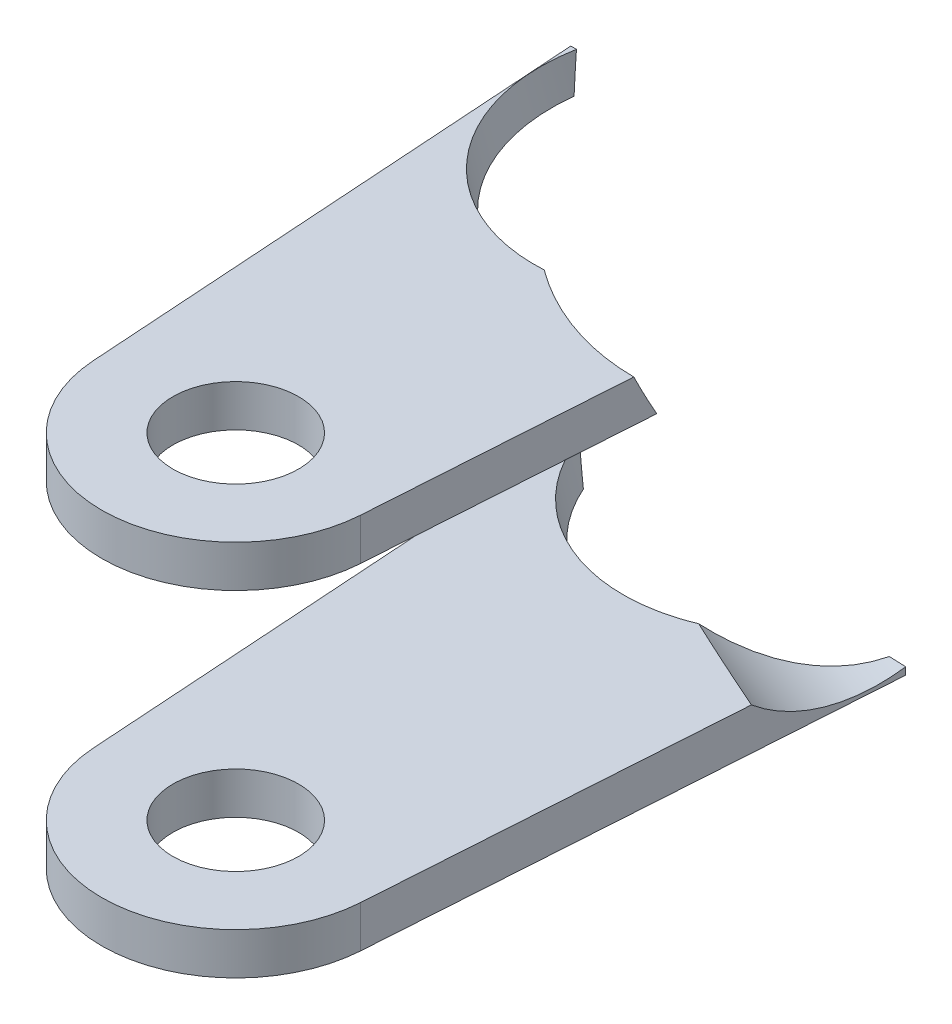
ISO-10303-21;
HEADER;
FILE_DESCRIPTION(('STEP AP214'),'2;1');
FILE_NAME('part.step','',(''),(''),'','','');
FILE_SCHEMA(('AUTOMOTIVE_DESIGN { 1 0 10303 214 1 1 1 1 }'));
ENDSEC;
DATA;
#1=APPLICATION_CONTEXT('core data for automotive mechanical design processes');
#2=APPLICATION_PROTOCOL_DEFINITION('international standard','automotive_design',2000,#1);
#3=PRODUCT_CONTEXT('',#1,'mechanical');
#4=PRODUCT('Part','Part','',(#3));
#5=PRODUCT_RELATED_PRODUCT_CATEGORY('part','',(#4));
#6=PRODUCT_DEFINITION_FORMATION('','',#4);
#7=PRODUCT_DEFINITION_CONTEXT('part definition',#1,'design');
#8=PRODUCT_DEFINITION('design','',#6,#7);
#9=PRODUCT_DEFINITION_SHAPE('','',#8);
#10=(LENGTH_UNIT() NAMED_UNIT(*) SI_UNIT(.MILLI.,.METRE.));
#11=(NAMED_UNIT(*) PLANE_ANGLE_UNIT() SI_UNIT($,.RADIAN.));
#12=(NAMED_UNIT(*) SI_UNIT($,.STERADIAN.) SOLID_ANGLE_UNIT());
#13=UNCERTAINTY_MEASURE_WITH_UNIT(LENGTH_MEASURE(1.E-05),#10,'distance_accuracy_value','');
#14=(GEOMETRIC_REPRESENTATION_CONTEXT(3) GLOBAL_UNCERTAINTY_ASSIGNED_CONTEXT((#13)) GLOBAL_UNIT_ASSIGNED_CONTEXT((#10,
#11,#12)) REPRESENTATION_CONTEXT('',''));
#15=CARTESIAN_POINT('',(0.,0.,0.));
#16=DIRECTION('',(0.,0.,1.));
#17=DIRECTION('',(1.,0.,0.));
#18=AXIS2_PLACEMENT_3D('',#15,#16,#17);
#19=CARTESIAN_POINT('',(3.17109766763384,220.113863817674,22.0614422229637));
#20=DIRECTION('',(-0.013871818318609,-0.962877794478014,-0.269581018541161));
#21=DIRECTION('',(-0.999896240744035,0.0144051291540904,0.));
#22=AXIS2_PLACEMENT_3D('',#19,#20,#21);
#23=CYLINDRICAL_SURFACE('',#22,12.7);
#24=CARTESIAN_POINT('',(-0.16036805510547,-11.13155,-42.6813263271571));
#25=DIRECTION('',(0.,1.,0.));
#26=DIRECTION('',(-0.0513889655776079,0.,-0.998678714210363));
#27=AXIS2_PLACEMENT_3D('',#24,#25,#26);
#28=ELLIPSE('',#27,13.1896280845118,12.7);
#29=CARTESIAN_POINT('',(4.64570925519736,-11.13155,-30.4542928114946));
#30=VERTEX_POINT('',#29);
#31=CARTESIAN_POINT('',(-12.0534953152457,-11.13155,-38.1));
#32=VERTEX_POINT('',#31);
#33=EDGE_CURVE('E218',#30,#32,#28,.F.);
#34=ORIENTED_EDGE('',*,*,#33,.F.);
#35=CARTESIAN_POINT('',(-1.50270421106491E-13,2.47198095326695E-13,-39.5647786155457));
#36=DIRECTION('',(-0.681508036132345,-0.612366440673234,-0.400692075070407));
#37=DIRECTION('',(0.661890322531393,-0.749348395185467,0.0194469424911433));
#38=AXIS2_PLACEMENT_3D('',#35,#36,#37);
#39=ELLIPSE('',#38,17.9605122421383,12.7);
#40=CARTESIAN_POINT('',(11.4522485980504,-13.7037631015714,-38.1));
#41=VERTEX_POINT('',#40);
#42=EDGE_CURVE('E203',#30,#41,#39,.F.);
#43=ORIENTED_EDGE('',*,*,#42,.T.);
#44=CARTESIAN_POINT('',(0.0753730471890922,5.23183275427799,-38.1));
#45=DIRECTION('',(0.,0.,1.));
#46=DIRECTION('',(-0.0144051291540903,-0.999896240744035,0.));
#47=AXIS2_PLACEMENT_3D('',#44,#45,#46);
#48=ELLIPSE('',#47,47.1101417626734,12.7);
#49=CARTESIAN_POINT('',(11.3714792605542,-14.30655,-38.1));
#50=VERTEX_POINT('',#49);
#51=EDGE_CURVE('E211',#41,#50,#48,.F.);
#52=ORIENTED_EDGE('',*,*,#51,.T.);
#53=CARTESIAN_POINT('',(-0.206109086225063,-14.30655,-43.5702446704576));
#54=DIRECTION('',(0.,1.,0.));
#55=DIRECTION('',(-0.0513889655776079,0.,-0.998678714210363));
#56=AXIS2_PLACEMENT_3D('',#53,#54,#55);
#57=ELLIPSE('',#56,13.1896280845118,12.7);
#58=CARTESIAN_POINT('',(-11.7427767355241,-14.30655,-38.1));
#59=VERTEX_POINT('',#58);
#60=EDGE_CURVE('E252',#50,#59,#57,.F.);
#61=ORIENTED_EDGE('',*,*,#60,.T.);
#62=EDGE_CURVE('E226',#59,#32,#48,.F.);
#63=ORIENTED_EDGE('',*,*,#62,.T.);
#64=EDGE_LOOP('',(#34,#43,#52,#61,#63));
#65=FACE_BOUND('',#64,.T.);
#66=ADVANCED_FACE('F148',(#65),#23,.F.);
#67=CARTESIAN_POINT('',(0.,-14.30655,-38.1));
#68=DIRECTION('',(0.,0.,1.));
#69=DIRECTION('',(1.,0.,0.));
#70=AXIS2_PLACEMENT_3D('',#67,#68,#69);
#71=PLANE('',#70);
#72=ORIENTED_EDGE('',*,*,#62,.F.);
#73=DIRECTION('',(1.,0.,0.));
#74=VECTOR('',#73,1.);
#75=CARTESIAN_POINT('',(0.,-14.30655,-38.1));
#76=LINE('',#75,#74);
#77=CARTESIAN_POINT('',(-12.7,-14.30655,-38.1));
#78=VERTEX_POINT('',#77);
#79=EDGE_CURVE('E262',#78,#59,#76,.T.);
#80=ORIENTED_EDGE('',*,*,#79,.F.);
#81=DIRECTION('',(0.,1.,0.));
#82=VECTOR('',#81,1.);
#83=CARTESIAN_POINT('',(-12.7,-14.30655,-38.1));
#84=LINE('',#83,#82);
#85=CARTESIAN_POINT('',(-12.7,-11.13155,-38.1));
#86=VERTEX_POINT('',#85);
#87=EDGE_CURVE('E244',#78,#86,#84,.T.);
#88=ORIENTED_EDGE('',*,*,#87,.T.);
#89=DIRECTION('',(1.,0.,0.));
#90=VECTOR('',#89,1.);
#91=CARTESIAN_POINT('',(0.,-11.13155,-38.1));
#92=LINE('',#91,#90);
#93=EDGE_CURVE('E152',#86,#32,#92,.T.);
#94=ORIENTED_EDGE('',*,*,#93,.T.);
#95=EDGE_LOOP('',(#72,#80,#88,#94));
#96=FACE_BOUND('',#95,.T.);
#97=ADVANCED_FACE('F306',(#96),#71,.F.);
#98=CARTESIAN_POINT('',(4.68364304593903,-0.477575824424958,-38.1));
#99=DIRECTION('',(0.,0.,1.));
#100=DIRECTION('',(-0.994841581932163,0.101440755412758,0.));
#101=AXIS2_PLACEMENT_3D('',#98,#99,#100);
#102=ELLIPSE('',#101,42.7489747236035,12.7);
#103=CARTESIAN_POINT('',(12.7,-13.7536305525017,-38.1));
#104=VERTEX_POINT('',#103);
#105=EDGE_CURVE('E13',#104,#41,#102,.F.);
#106=ORIENTED_EDGE('',*,*,#105,.F.);
#107=DIRECTION('',(0.,1.,0.));
#108=VECTOR('',#107,1.);
#109=CARTESIAN_POINT('',(12.7,-14.30655,-38.1));
#110=LINE('',#109,#108);
#111=CARTESIAN_POINT('',(12.7,-14.30655,-38.1));
#112=VERTEX_POINT('',#111);
#113=EDGE_CURVE('E234',#112,#104,#110,.T.);
#114=ORIENTED_EDGE('',*,*,#113,.F.);
#115=EDGE_CURVE('E266',#50,#112,#76,.T.);
#116=ORIENTED_EDGE('',*,*,#115,.F.);
#117=ORIENTED_EDGE('',*,*,#51,.F.);
#118=EDGE_LOOP('',(#106,#114,#116,#117));
#119=FACE_BOUND('',#118,.T.);
#120=ADVANCED_FACE('F150',(#119),#71,.F.);
#121=CARTESIAN_POINT('',(10.1378868864585,-14.30655,0.669962295486161));
#122=DIRECTION('',(0.997823512446701,0.,0.065941170815567));
#123=DIRECTION('',(0.065941170815567,0.,-0.997823512446701));
#124=AXIS2_PLACEMENT_3D('',#121,#122,#123);
#125=PLANE('',#124);
#126=ORIENTED_EDGE('',*,*,#113,.T.);
#127=CARTESIAN_POINT('',(12.5376755950058,-1.27842593893902,-35.643702880251));
#128=DIRECTION('',(0.997823512446701,0.,0.065941170815567));
#129=DIRECTION('',(0.0609199612436631,0.382747014080803,-0.921842438562198));
#130=AXIS2_PLACEMENT_3D('',#127,#128,#129);
#131=ELLIPSE('',#130,13.1273124297438,12.7);
#132=CARTESIAN_POINT('',(11.9746101856044,-11.13155,-27.1233824552835));
#133=VERTEX_POINT('',#132);
#134=EDGE_CURVE('E167',#104,#133,#131,.F.);
#135=ORIENTED_EDGE('',*,*,#134,.T.);
#136=DIRECTION('',(0.065941170815567,0.,-0.997823512446701));
#137=VECTOR('',#136,1.);
#138=CARTESIAN_POINT('',(10.1378868864585,-11.13155,0.669962295486161));
#139=LINE('',#138,#137);
#140=CARTESIAN_POINT('',(10.1378868864585,-11.13155,0.669962295486162));
#141=VERTEX_POINT('',#140);
#142=EDGE_CURVE('E222',#141,#133,#139,.T.);
#143=ORIENTED_EDGE('',*,*,#142,.F.);
#144=DIRECTION('',(0.,1.,0.));
#145=VECTOR('',#144,1.);
#146=CARTESIAN_POINT('',(10.1378868864585,-14.30655,0.669962295486162));
#147=LINE('',#146,#145);
#148=CARTESIAN_POINT('',(10.1378868864585,-14.30655,0.669962295486162));
#149=VERTEX_POINT('',#148);
#150=EDGE_CURVE('E271',#149,#141,#147,.T.);
#151=ORIENTED_EDGE('',*,*,#150,.F.);
#152=DIRECTION('',(0.065941170815567,0.,-0.997823512446701));
#153=VECTOR('',#152,1.);
#154=CARTESIAN_POINT('',(10.1378868864585,-14.30655,0.669962295486161));
#155=LINE('',#154,#153);
#156=EDGE_CURVE('E242',#149,#112,#155,.T.);
#157=ORIENTED_EDGE('',*,*,#156,.T.);
#158=EDGE_LOOP('',(#126,#135,#143,#151,#157));
#159=FACE_BOUND('',#158,.T.);
#160=ADVANCED_FACE('F291',(#159),#125,.T.);
#161=CARTESIAN_POINT('',(0.,-14.30655,0.));
#162=DIRECTION('',(0.,1.,0.));
#163=DIRECTION('',(0.,0.,1.));
#164=AXIS2_PLACEMENT_3D('',#161,#162,#163);
#165=CYLINDRICAL_SURFACE('',#164,10.16);
#166=CARTESIAN_POINT('',(0.,-11.13155,0.));
#167=DIRECTION('',(0.,1.,0.));
#168=DIRECTION('',(0.,0.,1.));
#169=AXIS2_PLACEMENT_3D('',#166,#167,#168);
#170=CIRCLE('',#169,10.16);
#171=CARTESIAN_POINT('',(-10.1378868864585,-11.13155,0.669962295486162));
#172=VERTEX_POINT('',#171);
#173=EDGE_CURVE('E159',#172,#141,#170,.T.);
#174=ORIENTED_EDGE('',*,*,#173,.F.);
#175=DIRECTION('',(0.,1.,0.));
#176=VECTOR('',#175,1.);
#177=CARTESIAN_POINT('',(-10.1378868864585,-14.30655,0.669962295486162));
#178=LINE('',#177,#176);
#179=CARTESIAN_POINT('',(-10.1378868864585,-14.30655,0.669962295486162));
#180=VERTEX_POINT('',#179);
#181=EDGE_CURVE('E254',#180,#172,#178,.T.);
#182=ORIENTED_EDGE('',*,*,#181,.F.);
#183=CARTESIAN_POINT('',(0.,-14.30655,0.));
#184=DIRECTION('',(0.,1.,0.));
#185=DIRECTION('',(0.,0.,1.));
#186=AXIS2_PLACEMENT_3D('',#183,#184,#185);
#187=CIRCLE('',#186,10.16);
#188=EDGE_CURVE('E267',#180,#149,#187,.T.);
#189=ORIENTED_EDGE('',*,*,#188,.T.);
#190=ORIENTED_EDGE('',*,*,#150,.T.);
#191=EDGE_LOOP('',(#174,#182,#189,#190));
#192=FACE_BOUND('',#191,.T.);
#193=ADVANCED_FACE('F287',(#192),#165,.T.);
#194=CARTESIAN_POINT('',(-10.1378868864585,-14.30655,0.669962295486161));
#195=DIRECTION('',(0.997823512446701,0.,-0.065941170815567));
#196=DIRECTION('',(-0.065941170815567,0.,-0.997823512446701));
#197=AXIS2_PLACEMENT_3D('',#194,#195,#196);
#198=PLANE('',#197);
#199=DIRECTION('',(-0.065941170815567,0.,-0.997823512446701));
#200=VECTOR('',#199,1.);
#201=CARTESIAN_POINT('',(-10.1378868864585,-11.13155,0.669962295486161));
#202=LINE('',#201,#200);
#203=EDGE_CURVE('E278',#172,#86,#202,.T.);
#204=ORIENTED_EDGE('',*,*,#203,.T.);
#205=ORIENTED_EDGE('',*,*,#87,.F.);
#206=DIRECTION('',(-0.065941170815567,0.,-0.997823512446701));
#207=VECTOR('',#206,1.);
#208=CARTESIAN_POINT('',(-10.1378868864585,-14.30655,0.669962295486161));
#209=LINE('',#208,#207);
#210=EDGE_CURVE('E263',#180,#78,#209,.T.);
#211=ORIENTED_EDGE('',*,*,#210,.F.);
#212=ORIENTED_EDGE('',*,*,#181,.T.);
#213=EDGE_LOOP('',(#204,#205,#211,#212));
#214=FACE_BOUND('',#213,.T.);
#215=ADVANCED_FACE('F299',(#214),#198,.F.);
#216=CARTESIAN_POINT('',(0.,-14.30655,0.));
#217=DIRECTION('',(0.,1.,0.));
#218=DIRECTION('',(0.,0.,1.));
#219=AXIS2_PLACEMENT_3D('',#216,#217,#218);
#220=CYLINDRICAL_SURFACE('',#219,4.7625);
#221=CARTESIAN_POINT('',(0.,-14.30655,0.));
#222=DIRECTION('',(0.,1.,0.));
#223=DIRECTION('',(0.,0.,1.));
#224=AXIS2_PLACEMENT_3D('',#221,#222,#223);
#225=CIRCLE('',#224,4.7625);
#226=CARTESIAN_POINT('',(0.,-14.30655,4.7625));
#227=VERTEX_POINT('',#226);
#228=EDGE_CURVE('E274',#227,#227,#225,.T.);
#229=ORIENTED_EDGE('',*,*,#228,.F.);
#230=EDGE_LOOP('',(#229));
#231=FACE_BOUND('',#230,.T.);
#232=CARTESIAN_POINT('',(0.,-11.13155,0.));
#233=DIRECTION('',(0.,1.,0.));
#234=DIRECTION('',(0.,0.,1.));
#235=AXIS2_PLACEMENT_3D('',#232,#233,#234);
#236=CIRCLE('',#235,4.7625);
#237=CARTESIAN_POINT('',(0.,-11.13155,4.7625));
#238=VERTEX_POINT('',#237);
#239=EDGE_CURVE('E281',#238,#238,#236,.T.);
#240=ORIENTED_EDGE('',*,*,#239,.T.);
#241=EDGE_LOOP('',(#240));
#242=FACE_BOUND('',#241,.T.);
#243=ADVANCED_FACE('F323',(#231,#242),#220,.F.);
#244=CARTESIAN_POINT('',(0.,-14.30655,0.));
#245=DIRECTION('',(0.,1.,0.));
#246=DIRECTION('',(0.,0.,1.));
#247=AXIS2_PLACEMENT_3D('',#244,#245,#246);
#248=PLANE('',#247);
#249=ORIENTED_EDGE('',*,*,#60,.F.);
#250=ORIENTED_EDGE('',*,*,#115,.T.);
#251=ORIENTED_EDGE('',*,*,#156,.F.);
#252=ORIENTED_EDGE('',*,*,#188,.F.);
#253=ORIENTED_EDGE('',*,*,#210,.T.);
#254=ORIENTED_EDGE('',*,*,#79,.T.);
#255=EDGE_LOOP('',(#249,#250,#251,#252,#253,#254));
#256=FACE_BOUND('',#255,.T.);
#257=ORIENTED_EDGE('',*,*,#228,.T.);
#258=EDGE_LOOP('',(#257));
#259=FACE_BOUND('',#258,.T.);
#260=ADVANCED_FACE('F301',(#256,#259),#248,.F.);
#261=CARTESIAN_POINT('',(0.,-11.13155,0.));
#262=DIRECTION('',(0.,1.,0.));
#263=DIRECTION('',(0.,0.,1.));
#264=AXIS2_PLACEMENT_3D('',#261,#262,#263);
#265=PLANE('',#264);
#266=ORIENTED_EDGE('',*,*,#142,.T.);
#267=CARTESIAN_POINT('',(109.168437935,-11.13155,-5.42306631781568));
#268=DIRECTION('',(0.,1.,0.));
#269=DIRECTION('',(-0.954413808532874,0.,-0.298486653104918));
#270=AXIS2_PLACEMENT_3D('',#267,#268,#269);
#271=ELLIPSE('',#270,131.115899945305,12.7);
#272=EDGE_CURVE('E206',#133,#30,#271,.F.);
#273=ORIENTED_EDGE('',*,*,#272,.T.);
#274=ORIENTED_EDGE('',*,*,#33,.T.);
#275=ORIENTED_EDGE('',*,*,#93,.F.);
#276=ORIENTED_EDGE('',*,*,#203,.F.);
#277=ORIENTED_EDGE('',*,*,#173,.T.);
#278=EDGE_LOOP('',(#266,#273,#274,#275,#276,#277));
#279=FACE_BOUND('',#278,.T.);
#280=ORIENTED_EDGE('',*,*,#239,.F.);
#281=EDGE_LOOP('',(#280));
#282=FACE_BOUND('',#281,.T.);
#283=ADVANCED_FACE('F215',(#279,#282),#265,.T.);
#284=CARTESIAN_POINT('',(117.314855269663,-11.9622136386577,-2.87532777581251));
#285=DIRECTION('',(-0.949926089246007,0.096860868935787,-0.297083148358826));
#286=DIRECTION('',(0.312166618372823,0.251960959218206,-0.91600637410638));
#287=AXIS2_PLACEMENT_3D('',#284,#285,#286);
#288=CYLINDRICAL_SURFACE('',#287,12.7);
#289=ORIENTED_EDGE('',*,*,#105,.T.);
#290=ORIENTED_EDGE('',*,*,#42,.F.);
#291=ORIENTED_EDGE('',*,*,#272,.F.);
#292=ORIENTED_EDGE('',*,*,#134,.F.);
#293=EDGE_LOOP('',(#289,#290,#291,#292));
#294=FACE_BOUND('',#293,.T.);
#295=ADVANCED_FACE('F205',(#294),#288,.F.);
#296=CLOSED_SHELL('',(#66,#97,#120,#160,#193,#215,#243,#260,#283,#295));
#297=MANIFOLD_SOLID_BREP('B2',#296);
#298=CARTESIAN_POINT('',(-10.1378868864585,14.30655,0.669962295486161));
#299=DIRECTION('',(-0.997823512446701,0.,0.065941170815567));
#300=DIRECTION('',(0.065941170815567,0.,0.997823512446701));
#301=AXIS2_PLACEMENT_3D('',#298,#299,#300);
#302=PLANE('',#301);
#303=DIRECTION('',(-0.065941170815567,0.,-0.997823512446701));
#304=VECTOR('',#303,1.);
#305=CARTESIAN_POINT('',(-10.1378868864585,11.13155,0.669962295486161));
#306=LINE('',#305,#304);
#307=CARTESIAN_POINT('',(-10.1378868864585,11.13155,0.669962295486162));
#308=VERTEX_POINT('',#307);
#309=CARTESIAN_POINT('',(-12.7,11.13155,-38.1));
#310=VERTEX_POINT('',#309);
#311=EDGE_CURVE('E493',#308,#310,#306,.T.);
#312=ORIENTED_EDGE('',*,*,#311,.F.);
#313=DIRECTION('',(0.,-1.,0.));
#314=VECTOR('',#313,1.);
#315=CARTESIAN_POINT('',(-10.1378868864585,14.30655,0.669962295486162));
#316=LINE('',#315,#314);
#317=CARTESIAN_POINT('',(-10.1378868864585,14.30655,0.669962295486162));
#318=VERTEX_POINT('',#317);
#319=EDGE_CURVE('E496',#318,#308,#316,.T.);
#320=ORIENTED_EDGE('',*,*,#319,.F.);
#321=DIRECTION('',(-0.065941170815567,0.,-0.997823512446701));
#322=VECTOR('',#321,1.);
#323=CARTESIAN_POINT('',(-10.1378868864585,14.30655,0.669962295486161));
#324=LINE('',#323,#322);
#325=CARTESIAN_POINT('',(-12.7,14.30655,-38.1));
#326=VERTEX_POINT('',#325);
#327=EDGE_CURVE('E500',#318,#326,#324,.T.);
#328=ORIENTED_EDGE('',*,*,#327,.T.);
#329=DIRECTION('',(0.,-1.,0.));
#330=VECTOR('',#329,1.);
#331=CARTESIAN_POINT('',(-12.7,14.30655,-38.1));
#332=LINE('',#331,#330);
#333=EDGE_CURVE('E497',#326,#310,#332,.T.);
#334=ORIENTED_EDGE('',*,*,#333,.T.);
#335=EDGE_LOOP('',(#312,#320,#328,#334));
#336=FACE_BOUND('',#335,.T.);
#337=ADVANCED_FACE('F402',(#336),#302,.T.);
#338=CARTESIAN_POINT('',(0.,14.30655,0.));
#339=DIRECTION('',(0.,-1.,0.));
#340=DIRECTION('',(0.,0.,-1.));
#341=AXIS2_PLACEMENT_3D('',#338,#339,#340);
#342=CYLINDRICAL_SURFACE('',#341,10.16);
#343=CARTESIAN_POINT('',(0.,11.13155,0.));
#344=DIRECTION('',(0.,1.,0.));
#345=DIRECTION('',(0.,0.,1.));
#346=AXIS2_PLACEMENT_3D('',#343,#344,#345);
#347=CIRCLE('',#346,10.16);
#348=CARTESIAN_POINT('',(10.1378868864585,11.13155,0.669962295486162));
#349=VERTEX_POINT('',#348);
#350=EDGE_CURVE('E495',#308,#349,#347,.T.);
#351=ORIENTED_EDGE('',*,*,#350,.T.);
#352=DIRECTION('',(0.,-1.,0.));
#353=VECTOR('',#352,1.);
#354=CARTESIAN_POINT('',(10.1378868864585,14.30655,0.669962295486162));
#355=LINE('',#354,#353);
#356=CARTESIAN_POINT('',(10.1378868864585,14.30655,0.669962295486162));
#357=VERTEX_POINT('',#356);
#358=EDGE_CURVE('E501',#357,#349,#355,.T.);
#359=ORIENTED_EDGE('',*,*,#358,.F.);
#360=CARTESIAN_POINT('',(0.,14.30655,0.));
#361=DIRECTION('',(0.,1.,0.));
#362=DIRECTION('',(0.,0.,1.));
#363=AXIS2_PLACEMENT_3D('',#360,#361,#362);
#364=CIRCLE('',#363,10.16);
#365=EDGE_CURVE('E476',#318,#357,#364,.T.);
#366=ORIENTED_EDGE('',*,*,#365,.F.);
#367=ORIENTED_EDGE('',*,*,#319,.T.);
#368=EDGE_LOOP('',(#351,#359,#366,#367));
#369=FACE_BOUND('',#368,.T.);
#370=ADVANCED_FACE('F507',(#369),#342,.T.);
#371=CARTESIAN_POINT('',(10.1378868864585,14.30655,0.669962295486161));
#372=DIRECTION('',(-0.997823512446701,0.,-0.065941170815567));
#373=DIRECTION('',(-0.065941170815567,0.,0.997823512446701));
#374=AXIS2_PLACEMENT_3D('',#371,#372,#373);
#375=PLANE('',#374);
#376=CARTESIAN_POINT('',(12.1420416601469,20.976603051953,-29.6569598843132));
#377=DIRECTION('',(-0.997823512446701,0.,-0.065941170815567));
#378=DIRECTION('',(-0.0262083361860295,0.91762371502674,0.396585225058731));
#379=AXIS2_PLACEMENT_3D('',#376,#377,#378);
#380=ELLIPSE('',#379,26.042806816391,12.7);
#381=CARTESIAN_POINT('',(11.4220500743455,14.30655,-18.7620284751373));
#382=VERTEX_POINT('',#381);
#383=CARTESIAN_POINT('',(11.5300248368222,11.13155,-20.3959053902345));
#384=VERTEX_POINT('',#383);
#385=EDGE_CURVE('E449',#382,#384,#380,.F.);
#386=ORIENTED_EDGE('',*,*,#385,.F.);
#387=DIRECTION('',(0.065941170815567,0.,-0.997823512446701));
#388=VECTOR('',#387,1.);
#389=CARTESIAN_POINT('',(10.1378868864585,14.30655,0.669962295486161));
#390=LINE('',#389,#388);
#391=EDGE_CURVE('E477',#357,#382,#390,.T.);
#392=ORIENTED_EDGE('',*,*,#391,.F.);
#393=ORIENTED_EDGE('',*,*,#358,.T.);
#394=DIRECTION('',(0.065941170815567,0.,-0.997823512446701));
#395=VECTOR('',#394,1.);
#396=CARTESIAN_POINT('',(10.1378868864585,11.13155,0.669962295486161));
#397=LINE('',#396,#395);
#398=EDGE_CURVE('E406',#349,#384,#397,.T.);
#399=ORIENTED_EDGE('',*,*,#398,.T.);
#400=EDGE_LOOP('',(#386,#392,#393,#399));
#401=FACE_BOUND('',#400,.T.);
#402=ADVANCED_FACE('F520',(#401),#375,.F.);
#403=CARTESIAN_POINT('',(0.,14.30655,-38.1));
#404=DIRECTION('',(0.,0.,-1.));
#405=DIRECTION('',(-1.,0.,0.));
#406=AXIS2_PLACEMENT_3D('',#403,#404,#405);
#407=PLANE('',#406);
#408=DIRECTION('',(1.,0.,0.));
#409=VECTOR('',#408,1.);
#410=CARTESIAN_POINT('',(0.,14.30655,-38.1));
#411=LINE('',#410,#409);
#412=CARTESIAN_POINT('',(-12.2667001888941,14.30655,-38.1));
#413=VERTEX_POINT('',#412);
#414=EDGE_CURVE('E488',#326,#413,#411,.T.);
#415=ORIENTED_EDGE('',*,*,#414,.T.);
#416=CARTESIAN_POINT('',(0.0753730471890922,5.23183275427799,-38.1));
#417=DIRECTION('',(0.,0.,-1.));
#418=DIRECTION('',(-0.0144051291540903,-0.999896240744035,0.));
#419=AXIS2_PLACEMENT_3D('',#416,#417,#418);
#420=ELLIPSE('',#419,47.1101417626734,12.7);
#421=CARTESIAN_POINT('',(-12.4470215803562,11.13155,-38.1));
#422=VERTEX_POINT('',#421);
#423=EDGE_CURVE('E484',#413,#422,#420,.F.);
#424=ORIENTED_EDGE('',*,*,#423,.T.);
#425=DIRECTION('',(1.,0.,0.));
#426=VECTOR('',#425,1.);
#427=CARTESIAN_POINT('',(0.,11.13155,-38.1));
#428=LINE('',#427,#426);
#429=EDGE_CURVE('E469',#310,#422,#428,.T.);
#430=ORIENTED_EDGE('',*,*,#429,.F.);
#431=ORIENTED_EDGE('',*,*,#333,.F.);
#432=EDGE_LOOP('',(#415,#424,#430,#431));
#433=FACE_BOUND('',#432,.T.);
#434=ADVANCED_FACE('F516',(#433),#407,.T.);
#435=CARTESIAN_POINT('',(0.,14.30655,0.));
#436=DIRECTION('',(0.,-1.,0.));
#437=DIRECTION('',(0.,0.,-1.));
#438=AXIS2_PLACEMENT_3D('',#435,#436,#437);
#439=CYLINDRICAL_SURFACE('',#438,4.7625);
#440=CARTESIAN_POINT('',(0.,14.30655,0.));
#441=DIRECTION('',(0.,1.,0.));
#442=DIRECTION('',(0.,0.,1.));
#443=AXIS2_PLACEMENT_3D('',#440,#441,#442);
#444=CIRCLE('',#443,4.7625);
#445=CARTESIAN_POINT('',(0.,14.30655,4.7625));
#446=VERTEX_POINT('',#445);
#447=EDGE_CURVE('E479',#446,#446,#444,.T.);
#448=ORIENTED_EDGE('',*,*,#447,.T.);
#449=EDGE_LOOP('',(#448));
#450=FACE_BOUND('',#449,.T.);
#451=CARTESIAN_POINT('',(0.,11.13155,0.));
#452=DIRECTION('',(0.,1.,0.));
#453=DIRECTION('',(0.,0.,1.));
#454=AXIS2_PLACEMENT_3D('',#451,#452,#453);
#455=CIRCLE('',#454,4.7625);
#456=CARTESIAN_POINT('',(0.,11.13155,4.7625));
#457=VERTEX_POINT('',#456);
#458=EDGE_CURVE('E470',#457,#457,#455,.T.);
#459=ORIENTED_EDGE('',*,*,#458,.F.);
#460=EDGE_LOOP('',(#459));
#461=FACE_BOUND('',#460,.T.);
#462=ADVANCED_FACE('F526',(#450,#461),#439,.F.);
#463=CARTESIAN_POINT('',(0.,14.30655,0.));
#464=DIRECTION('',(0.,1.,0.));
#465=DIRECTION('',(0.,0.,1.));
#466=AXIS2_PLACEMENT_3D('',#463,#464,#465);
#467=PLANE('',#466);
#468=ORIENTED_EDGE('',*,*,#391,.T.);
#469=CARTESIAN_POINT('',(8.28116571986139,14.30655,-32.8074069039178));
#470=DIRECTION('',(0.,1.,0.));
#471=DIRECTION('',(0.774787847465351,0.,0.632221315221188));
#472=AXIS2_PLACEMENT_3D('',#469,#470,#471);
#473=ELLIPSE('',#472,15.8528642903054,12.7);
#474=CARTESIAN_POINT('',(0.991045245278553,14.30655,-22.3930959683463));
#475=VERTEX_POINT('',#474);
#476=EDGE_CURVE('E420',#382,#475,#473,.F.);
#477=ORIENTED_EDGE('',*,*,#476,.T.);
#478=CARTESIAN_POINT('',(0.206109086224706,14.30655,-35.5593125606339));
#479=DIRECTION('',(0.,1.,0.));
#480=DIRECTION('',(-0.0513889655776079,0.,-0.998678714210363));
#481=AXIS2_PLACEMENT_3D('',#478,#479,#480);
#482=ELLIPSE('',#481,13.1896280845118,12.7);
#483=EDGE_CURVE('E463',#475,#413,#482,.F.);
#484=ORIENTED_EDGE('',*,*,#483,.T.);
#485=ORIENTED_EDGE('',*,*,#414,.F.);
#486=ORIENTED_EDGE('',*,*,#327,.F.);
#487=ORIENTED_EDGE('',*,*,#365,.T.);
#488=EDGE_LOOP('',(#468,#477,#484,#485,#486,#487));
#489=FACE_BOUND('',#488,.T.);
#490=ORIENTED_EDGE('',*,*,#447,.F.);
#491=EDGE_LOOP('',(#490));
#492=FACE_BOUND('',#491,.T.);
#493=ADVANCED_FACE('F539',(#489,#492),#467,.T.);
#494=CARTESIAN_POINT('',(0.,11.13155,0.));
#495=DIRECTION('',(0.,1.,0.));
#496=DIRECTION('',(0.,0.,1.));
#497=AXIS2_PLACEMENT_3D('',#494,#495,#496);
#498=PLANE('',#497);
#499=CARTESIAN_POINT('',(6.44335708251972,11.13155,-34.3070455438708));
#500=DIRECTION('',(0.,1.,0.));
#501=DIRECTION('',(0.774787847465351,0.,0.632221315221188));
#502=AXIS2_PLACEMENT_3D('',#499,#500,#501);
#503=ELLIPSE('',#502,15.8528642903054,12.7);
#504=CARTESIAN_POINT('',(0.0592186862662198,11.13155,-23.260797473932));
#505=VERTEX_POINT('',#504);
#506=EDGE_CURVE('E412',#384,#505,#503,.F.);
#507=ORIENTED_EDGE('',*,*,#506,.F.);
#508=ORIENTED_EDGE('',*,*,#398,.F.);
#509=ORIENTED_EDGE('',*,*,#350,.F.);
#510=ORIENTED_EDGE('',*,*,#311,.T.);
#511=ORIENTED_EDGE('',*,*,#429,.T.);
#512=CARTESIAN_POINT('',(0.160368055105113,11.13155,-36.4482309039344));
#513=DIRECTION('',(0.,1.,0.));
#514=DIRECTION('',(-0.0513889655776079,0.,-0.998678714210363));
#515=AXIS2_PLACEMENT_3D('',#512,#513,#514);
#516=ELLIPSE('',#515,13.1896280845118,12.7);
#517=EDGE_CURVE('E461',#505,#422,#516,.F.);
#518=ORIENTED_EDGE('',*,*,#517,.F.);
#519=EDGE_LOOP('',(#507,#508,#509,#510,#511,#518));
#520=FACE_BOUND('',#519,.T.);
#521=ORIENTED_EDGE('',*,*,#458,.T.);
#522=EDGE_LOOP('',(#521));
#523=FACE_BOUND('',#522,.T.);
#524=ADVANCED_FACE('F465',(#520,#523),#498,.F.);
#525=CARTESIAN_POINT('',(3.17109766763384,220.113863817674,22.0614422229637));
#526=DIRECTION('',(-0.013871818318609,-0.962877794478014,-0.269581018541161));
#527=DIRECTION('',(-0.999896240744035,0.0144051291540904,0.));
#528=AXIS2_PLACEMENT_3D('',#525,#526,#527);
#529=CYLINDRICAL_SURFACE('',#528,12.7);
#530=CARTESIAN_POINT('',(-2.0122792321331E-13,0.,-39.5647786155458));
#531=DIRECTION('',(0.917542209255821,-0.329941230100136,0.221934852859925));
#532=DIRECTION('',(0.246309351441686,0.909755164706335,0.334181453229418));
#533=AXIS2_PLACEMENT_3D('',#530,#531,#532);
#534=ELLIPSE('',#533,51.8080433073034,12.7);
#535=EDGE_CURVE('E146',#505,#475,#534,.F.);
#536=ORIENTED_EDGE('',*,*,#535,.F.);
#537=ORIENTED_EDGE('',*,*,#517,.T.);
#538=ORIENTED_EDGE('',*,*,#423,.F.);
#539=ORIENTED_EDGE('',*,*,#483,.F.);
#540=EDGE_LOOP('',(#536,#537,#538,#539));
#541=FACE_BOUND('',#540,.T.);
#542=ADVANCED_FACE('F404',(#541),#529,.F.);
#543=CARTESIAN_POINT('',(-1.73472347597681E-13,0.,-39.5647786155458));
#544=DIRECTION('',(0.463716487742988,0.801117057929177,0.37838932132158));
#545=DIRECTION('',(0.882998644782482,-0.452913834964766,-0.123217090575167));
#546=AXIS2_PLACEMENT_3D('',#543,#544,#545);
#547=CYLINDRICAL_SURFACE('',#546,12.7);
#548=ORIENTED_EDGE('',*,*,#385,.T.);
#549=ORIENTED_EDGE('',*,*,#506,.T.);
#550=ORIENTED_EDGE('',*,*,#535,.T.);
#551=ORIENTED_EDGE('',*,*,#476,.F.);
#552=EDGE_LOOP('',(#548,#549,#550,#551));
#553=FACE_BOUND('',#552,.T.);
#554=ADVANCED_FACE('F452',(#553),#547,.F.);
#555=CLOSED_SHELL('',(#337,#370,#402,#434,#462,#493,#524,#542,#554));
#556=MANIFOLD_SOLID_BREP('B7',#555);
#557=ADVANCED_BREP_SHAPE_REPRESENTATION('',(#18,#297,#556),#14);
#558=SHAPE_DEFINITION_REPRESENTATION(#9,#557);
ENDSEC;
END-ISO-10303-21;
